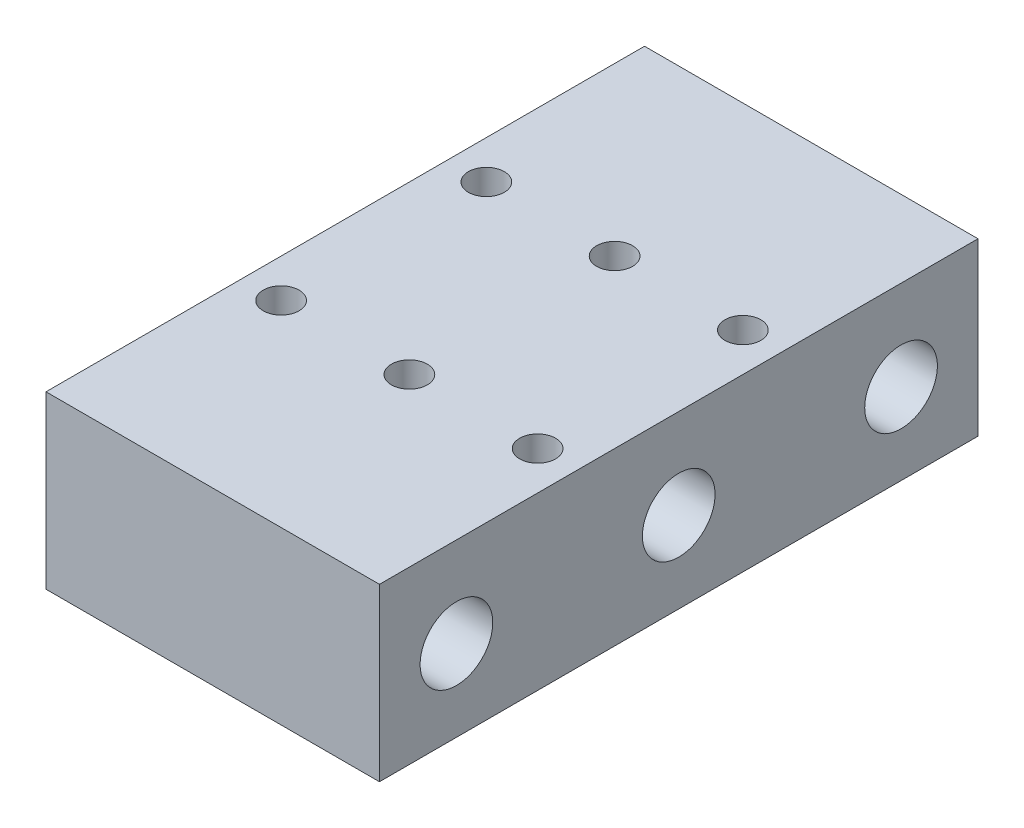
ISO-10303-21;
HEADER;
FILE_DESCRIPTION(('STEP AP214'),'2;1');
FILE_NAME('part.step','',(''),(''),'','','');
FILE_SCHEMA(('AUTOMOTIVE_DESIGN { 1 0 10303 214 1 1 1 1 }'));
ENDSEC;
DATA;
#1=APPLICATION_CONTEXT('core data for automotive mechanical design processes');
#2=APPLICATION_PROTOCOL_DEFINITION('international standard','automotive_design',2000,#1);
#3=PRODUCT_CONTEXT('',#1,'mechanical');
#4=PRODUCT('Part','Part','',(#3));
#5=PRODUCT_RELATED_PRODUCT_CATEGORY('part','',(#4));
#6=PRODUCT_DEFINITION_FORMATION('','',#4);
#7=PRODUCT_DEFINITION_CONTEXT('part definition',#1,'design');
#8=PRODUCT_DEFINITION('design','',#6,#7);
#9=PRODUCT_DEFINITION_SHAPE('','',#8);
#10=(LENGTH_UNIT() NAMED_UNIT(*) SI_UNIT(.MILLI.,.METRE.));
#11=(NAMED_UNIT(*) PLANE_ANGLE_UNIT() SI_UNIT($,.RADIAN.));
#12=(NAMED_UNIT(*) SI_UNIT($,.STERADIAN.) SOLID_ANGLE_UNIT());
#13=UNCERTAINTY_MEASURE_WITH_UNIT(LENGTH_MEASURE(1.E-05),#10,'distance_accuracy_value','');
#14=(GEOMETRIC_REPRESENTATION_CONTEXT(3) GLOBAL_UNCERTAINTY_ASSIGNED_CONTEXT((#13)) GLOBAL_UNIT_ASSIGNED_CONTEXT((#10,
#11,#12)) REPRESENTATION_CONTEXT('',''));
#15=CARTESIAN_POINT('',(0.,0.,0.));
#16=DIRECTION('',(0.,0.,1.));
#17=DIRECTION('',(1.,0.,0.));
#18=AXIS2_PLACEMENT_3D('',#15,#16,#17);
#19=CARTESIAN_POINT('',(19.5,-20.,35.));
#20=DIRECTION('',(1.,0.,0.));
#21=DIRECTION('',(0.,0.,-1.));
#22=AXIS2_PLACEMENT_3D('',#19,#20,#21);
#23=PLANE('',#22);
#24=CARTESIAN_POINT('',(19.5,-10.5,-25.9999999999618));
#25=DIRECTION('',(-1.,0.,0.));
#26=DIRECTION('',(0.,0.,1.));
#27=AXIS2_PLACEMENT_3D('',#24,#25,#26);
#28=CIRCLE('',#27,4.25);
#29=CARTESIAN_POINT('',(19.5,-10.5,-21.7499999999618));
#30=VERTEX_POINT('',#29);
#31=EDGE_CURVE('E204',#30,#30,#28,.T.);
#32=ORIENTED_EDGE('',*,*,#31,.T.);
#33=EDGE_LOOP('',(#32));
#34=FACE_BOUND('',#33,.T.);
#35=CARTESIAN_POINT('',(19.5,-10.5,26.0000000000382));
#36=DIRECTION('',(-1.,0.,0.));
#37=DIRECTION('',(0.,0.,1.));
#38=AXIS2_PLACEMENT_3D('',#35,#36,#37);
#39=CIRCLE('',#38,4.25);
#40=CARTESIAN_POINT('',(19.5,-10.5,30.2500000000382));
#41=VERTEX_POINT('',#40);
#42=EDGE_CURVE('E213',#41,#41,#39,.T.);
#43=ORIENTED_EDGE('',*,*,#42,.T.);
#44=EDGE_LOOP('',(#43));
#45=FACE_BOUND('',#44,.T.);
#46=CARTESIAN_POINT('',(19.5,-10.4999999999909,0.));
#47=DIRECTION('',(-1.,0.,0.));
#48=DIRECTION('',(0.,0.,1.));
#49=AXIS2_PLACEMENT_3D('',#46,#47,#48);
#50=CIRCLE('',#49,4.2499999999998);
#51=CARTESIAN_POINT('',(19.5,-10.4999999999909,4.2499999999998));
#52=VERTEX_POINT('',#51);
#53=EDGE_CURVE('E222',#52,#52,#50,.T.);
#54=ORIENTED_EDGE('',*,*,#53,.T.);
#55=EDGE_LOOP('',(#54));
#56=FACE_BOUND('',#55,.T.);
#57=DIRECTION('',(0.,0.,-1.));
#58=VECTOR('',#57,1.);
#59=CARTESIAN_POINT('',(19.5,0.,35.));
#60=LINE('',#59,#58);
#61=CARTESIAN_POINT('',(19.5,0.,35.));
#62=VERTEX_POINT('',#61);
#63=CARTESIAN_POINT('',(19.5,0.,-35.));
#64=VERTEX_POINT('',#63);
#65=EDGE_CURVE('E107',#62,#64,#60,.T.);
#66=ORIENTED_EDGE('',*,*,#65,.F.);
#67=DIRECTION('',(0.,1.,0.));
#68=VECTOR('',#67,1.);
#69=CARTESIAN_POINT('',(19.5,-20.,35.));
#70=LINE('',#69,#68);
#71=CARTESIAN_POINT('',(19.5,-20.,35.));
#72=VERTEX_POINT('',#71);
#73=EDGE_CURVE('E11',#72,#62,#70,.T.);
#74=ORIENTED_EDGE('',*,*,#73,.F.);
#75=DIRECTION('',(0.,0.,-1.));
#76=VECTOR('',#75,1.);
#77=CARTESIAN_POINT('',(19.5,-20.,35.));
#78=LINE('',#77,#76);
#79=CARTESIAN_POINT('',(19.5,-20.,-35.));
#80=VERTEX_POINT('',#79);
#81=EDGE_CURVE('E101',#72,#80,#78,.T.);
#82=ORIENTED_EDGE('',*,*,#81,.T.);
#83=DIRECTION('',(0.,1.,0.));
#84=VECTOR('',#83,1.);
#85=CARTESIAN_POINT('',(19.5,-20.,-35.));
#86=LINE('',#85,#84);
#87=EDGE_CURVE('E46',#80,#64,#86,.T.);
#88=ORIENTED_EDGE('',*,*,#87,.T.);
#89=EDGE_LOOP('',(#66,#74,#82,#88));
#90=FACE_BOUND('',#89,.T.);
#91=ADVANCED_FACE('F43',(#34,#45,#56,#90),#23,.T.);
#92=CARTESIAN_POINT('',(-19.5,-20.,35.));
#93=DIRECTION('',(0.,0.,1.));
#94=DIRECTION('',(1.,0.,0.));
#95=AXIS2_PLACEMENT_3D('',#92,#93,#94);
#96=PLANE('',#95);
#97=DIRECTION('',(1.,0.,0.));
#98=VECTOR('',#97,1.);
#99=CARTESIAN_POINT('',(-19.5,0.,35.));
#100=LINE('',#99,#98);
#101=CARTESIAN_POINT('',(-19.5,0.,35.));
#102=VERTEX_POINT('',#101);
#103=EDGE_CURVE('E103',#102,#62,#100,.T.);
#104=ORIENTED_EDGE('',*,*,#103,.F.);
#105=DIRECTION('',(0.,1.,0.));
#106=VECTOR('',#105,1.);
#107=CARTESIAN_POINT('',(-19.5,-20.,35.));
#108=LINE('',#107,#106);
#109=CARTESIAN_POINT('',(-19.5,-20.,35.));
#110=VERTEX_POINT('',#109);
#111=EDGE_CURVE('E55',#110,#102,#108,.T.);
#112=ORIENTED_EDGE('',*,*,#111,.F.);
#113=DIRECTION('',(1.,0.,0.));
#114=VECTOR('',#113,1.);
#115=CARTESIAN_POINT('',(-19.5,-20.,35.));
#116=LINE('',#115,#114);
#117=EDGE_CURVE('E98',#110,#72,#116,.T.);
#118=ORIENTED_EDGE('',*,*,#117,.T.);
#119=ORIENTED_EDGE('',*,*,#73,.T.);
#120=EDGE_LOOP('',(#104,#112,#118,#119));
#121=FACE_BOUND('',#120,.T.);
#122=ADVANCED_FACE('F118',(#121),#96,.T.);
#123=CARTESIAN_POINT('',(-19.5,-20.,35.));
#124=DIRECTION('',(-1.,0.,0.));
#125=DIRECTION('',(0.,0.,1.));
#126=AXIS2_PLACEMENT_3D('',#123,#124,#125);
#127=PLANE('',#126);
#128=CARTESIAN_POINT('',(-19.5,-10.5,-25.9999999999618));
#129=DIRECTION('',(-1.,0.,0.));
#130=DIRECTION('',(0.,0.,1.));
#131=AXIS2_PLACEMENT_3D('',#128,#129,#130);
#132=CIRCLE('',#131,4.25);
#133=CARTESIAN_POINT('',(-19.5,-10.5,-21.7499999999618));
#134=VERTEX_POINT('',#133);
#135=EDGE_CURVE('E210',#134,#134,#132,.T.);
#136=ORIENTED_EDGE('',*,*,#135,.F.);
#137=EDGE_LOOP('',(#136));
#138=FACE_BOUND('',#137,.T.);
#139=CARTESIAN_POINT('',(-19.5,-10.5,26.0000000000382));
#140=DIRECTION('',(-1.,0.,0.));
#141=DIRECTION('',(0.,0.,1.));
#142=AXIS2_PLACEMENT_3D('',#139,#140,#141);
#143=CIRCLE('',#142,4.25);
#144=CARTESIAN_POINT('',(-19.5,-10.5,30.2500000000382));
#145=VERTEX_POINT('',#144);
#146=EDGE_CURVE('E208',#145,#145,#143,.T.);
#147=ORIENTED_EDGE('',*,*,#146,.F.);
#148=EDGE_LOOP('',(#147));
#149=FACE_BOUND('',#148,.T.);
#150=CARTESIAN_POINT('',(-19.5,-10.4999999999909,0.));
#151=DIRECTION('',(-1.,0.,0.));
#152=DIRECTION('',(0.,0.,1.));
#153=AXIS2_PLACEMENT_3D('',#150,#151,#152);
#154=CIRCLE('',#153,4.2499999999998);
#155=CARTESIAN_POINT('',(-19.5,-10.4999999999909,4.2499999999998));
#156=VERTEX_POINT('',#155);
#157=EDGE_CURVE('E217',#156,#156,#154,.T.);
#158=ORIENTED_EDGE('',*,*,#157,.F.);
#159=EDGE_LOOP('',(#158));
#160=FACE_BOUND('',#159,.T.);
#161=DIRECTION('',(0.,0.,1.));
#162=VECTOR('',#161,1.);
#163=CARTESIAN_POINT('',(-19.5,0.,35.));
#164=LINE('',#163,#162);
#165=CARTESIAN_POINT('',(-19.5,0.,-35.));
#166=VERTEX_POINT('',#165);
#167=EDGE_CURVE('E91',#166,#102,#164,.T.);
#168=ORIENTED_EDGE('',*,*,#167,.F.);
#169=DIRECTION('',(0.,1.,0.));
#170=VECTOR('',#169,1.);
#171=CARTESIAN_POINT('',(-19.5,-20.,-35.));
#172=LINE('',#171,#170);
#173=CARTESIAN_POINT('',(-19.5,-20.,-35.));
#174=VERTEX_POINT('',#173);
#175=EDGE_CURVE('E86',#174,#166,#172,.T.);
#176=ORIENTED_EDGE('',*,*,#175,.F.);
#177=DIRECTION('',(0.,0.,1.));
#178=VECTOR('',#177,1.);
#179=CARTESIAN_POINT('',(-19.5,-20.,35.));
#180=LINE('',#179,#178);
#181=EDGE_CURVE('E93',#174,#110,#180,.T.);
#182=ORIENTED_EDGE('',*,*,#181,.T.);
#183=ORIENTED_EDGE('',*,*,#111,.T.);
#184=EDGE_LOOP('',(#168,#176,#182,#183));
#185=FACE_BOUND('',#184,.T.);
#186=ADVANCED_FACE('F89',(#138,#149,#160,#185),#127,.T.);
#187=CARTESIAN_POINT('',(-19.5,-20.,-35.));
#188=DIRECTION('',(0.,0.,-1.));
#189=DIRECTION('',(-1.,0.,0.));
#190=AXIS2_PLACEMENT_3D('',#187,#188,#189);
#191=PLANE('',#190);
#192=DIRECTION('',(-1.,0.,0.));
#193=VECTOR('',#192,1.);
#194=CARTESIAN_POINT('',(-19.5,0.,-35.));
#195=LINE('',#194,#193);
#196=EDGE_CURVE('E112',#64,#166,#195,.T.);
#197=ORIENTED_EDGE('',*,*,#196,.F.);
#198=ORIENTED_EDGE('',*,*,#87,.F.);
#199=DIRECTION('',(-1.,0.,0.));
#200=VECTOR('',#199,1.);
#201=CARTESIAN_POINT('',(-19.5,-20.,-35.));
#202=LINE('',#201,#200);
#203=EDGE_CURVE('E100',#80,#174,#202,.T.);
#204=ORIENTED_EDGE('',*,*,#203,.T.);
#205=ORIENTED_EDGE('',*,*,#175,.T.);
#206=EDGE_LOOP('',(#197,#198,#204,#205));
#207=FACE_BOUND('',#206,.T.);
#208=ADVANCED_FACE('F99',(#207),#191,.T.);
#209=CARTESIAN_POINT('',(0.,-20.,0.));
#210=DIRECTION('',(0.,-1.,0.));
#211=DIRECTION('',(0.,0.,-1.));
#212=AXIS2_PLACEMENT_3D('',#209,#210,#211);
#213=PLANE('',#212);
#214=ORIENTED_EDGE('',*,*,#81,.F.);
#215=ORIENTED_EDGE('',*,*,#117,.F.);
#216=ORIENTED_EDGE('',*,*,#181,.F.);
#217=ORIENTED_EDGE('',*,*,#203,.F.);
#218=EDGE_LOOP('',(#214,#215,#216,#217));
#219=FACE_BOUND('',#218,.T.);
#220=ADVANCED_FACE('F96',(#219),#213,.T.);
#221=CARTESIAN_POINT('',(0.,0.,0.));
#222=DIRECTION('',(0.,-1.,0.));
#223=DIRECTION('',(0.,0.,-1.));
#224=AXIS2_PLACEMENT_3D('',#221,#222,#223);
#225=PLANE('',#224);
#226=CARTESIAN_POINT('',(15.,0.,-12.));
#227=DIRECTION('',(0.,1.,0.));
#228=DIRECTION('',(0.,0.,1.));
#229=AXIS2_PLACEMENT_3D('',#226,#227,#228);
#230=CIRCLE('',#229,2.1);
#231=CARTESIAN_POINT('',(15.,0.,-9.9));
#232=VERTEX_POINT('',#231);
#233=EDGE_CURVE('E229',#232,#232,#230,.T.);
#234=ORIENTED_EDGE('',*,*,#233,.F.);
#235=EDGE_LOOP('',(#234));
#236=FACE_BOUND('',#235,.T.);
#237=CARTESIAN_POINT('',(0.,0.,-12.));
#238=DIRECTION('',(0.,1.,0.));
#239=DIRECTION('',(0.,0.,1.));
#240=AXIS2_PLACEMENT_3D('',#237,#238,#239);
#241=CIRCLE('',#240,2.1);
#242=CARTESIAN_POINT('',(0.,0.,-9.9));
#243=VERTEX_POINT('',#242);
#244=EDGE_CURVE('E240',#243,#243,#241,.T.);
#245=ORIENTED_EDGE('',*,*,#244,.F.);
#246=EDGE_LOOP('',(#245));
#247=FACE_BOUND('',#246,.T.);
#248=CARTESIAN_POINT('',(-15.,0.,12.));
#249=DIRECTION('',(0.,1.,0.));
#250=DIRECTION('',(0.,0.,1.));
#251=AXIS2_PLACEMENT_3D('',#248,#249,#250);
#252=CIRCLE('',#251,2.1);
#253=CARTESIAN_POINT('',(-15.,0.,14.1));
#254=VERTEX_POINT('',#253);
#255=EDGE_CURVE('E242',#254,#254,#252,.T.);
#256=ORIENTED_EDGE('',*,*,#255,.F.);
#257=EDGE_LOOP('',(#256));
#258=FACE_BOUND('',#257,.T.);
#259=CARTESIAN_POINT('',(0.,0.,12.));
#260=DIRECTION('',(0.,1.,0.));
#261=DIRECTION('',(0.,0.,1.));
#262=AXIS2_PLACEMENT_3D('',#259,#260,#261);
#263=CIRCLE('',#262,2.1);
#264=CARTESIAN_POINT('',(0.,0.,14.1));
#265=VERTEX_POINT('',#264);
#266=EDGE_CURVE('E248',#265,#265,#263,.T.);
#267=ORIENTED_EDGE('',*,*,#266,.F.);
#268=EDGE_LOOP('',(#267));
#269=FACE_BOUND('',#268,.T.);
#270=CARTESIAN_POINT('',(15.,0.,12.));
#271=DIRECTION('',(0.,1.,0.));
#272=DIRECTION('',(0.,0.,1.));
#273=AXIS2_PLACEMENT_3D('',#270,#271,#272);
#274=CIRCLE('',#273,2.1);
#275=CARTESIAN_POINT('',(15.,0.,14.1));
#276=VERTEX_POINT('',#275);
#277=EDGE_CURVE('E221',#276,#276,#274,.T.);
#278=ORIENTED_EDGE('',*,*,#277,.F.);
#279=EDGE_LOOP('',(#278));
#280=FACE_BOUND('',#279,.T.);
#281=CARTESIAN_POINT('',(-15.,0.,-12.));
#282=DIRECTION('',(0.,1.,0.));
#283=DIRECTION('',(0.,0.,1.));
#284=AXIS2_PLACEMENT_3D('',#281,#282,#283);
#285=CIRCLE('',#284,2.1);
#286=CARTESIAN_POINT('',(-15.,0.,-9.9));
#287=VERTEX_POINT('',#286);
#288=EDGE_CURVE('E232',#287,#287,#285,.T.);
#289=ORIENTED_EDGE('',*,*,#288,.F.);
#290=EDGE_LOOP('',(#289));
#291=FACE_BOUND('',#290,.T.);
#292=ORIENTED_EDGE('',*,*,#65,.T.);
#293=ORIENTED_EDGE('',*,*,#196,.T.);
#294=ORIENTED_EDGE('',*,*,#167,.T.);
#295=ORIENTED_EDGE('',*,*,#103,.T.);
#296=EDGE_LOOP('',(#292,#293,#294,#295));
#297=FACE_BOUND('',#296,.T.);
#298=ADVANCED_FACE('F117',(#236,#247,#258,#269,#280,#291,#297),#225,.F.);
#299=CARTESIAN_POINT('',(-15.,-15.,-12.));
#300=DIRECTION('',(0.,1.,0.));
#301=DIRECTION('',(0.,0.,1.));
#302=AXIS2_PLACEMENT_3D('',#299,#300,#301);
#303=CYLINDRICAL_SURFACE('',#302,2.1);
#304=CARTESIAN_POINT('',(-15.,-15.,-12.));
#305=DIRECTION('',(0.,1.,0.));
#306=DIRECTION('',(0.,0.,1.));
#307=AXIS2_PLACEMENT_3D('',#304,#305,#306);
#308=CIRCLE('',#307,2.1);
#309=CARTESIAN_POINT('',(-15.,-15.,-9.9));
#310=VERTEX_POINT('',#309);
#311=EDGE_CURVE('E115',#310,#310,#308,.T.);
#312=ORIENTED_EDGE('',*,*,#311,.F.);
#313=EDGE_LOOP('',(#312));
#314=FACE_BOUND('',#313,.T.);
#315=ORIENTED_EDGE('',*,*,#288,.T.);
#316=EDGE_LOOP('',(#315));
#317=FACE_BOUND('',#316,.T.);
#318=ADVANCED_FACE('F140',(#314,#317),#303,.F.);
#319=CARTESIAN_POINT('',(-15.,-15.,-12.));
#320=DIRECTION('',(0.,1.,0.));
#321=DIRECTION('',(0.,0.,1.));
#322=AXIS2_PLACEMENT_3D('',#319,#320,#321);
#323=PLANE('',#322);
#324=ORIENTED_EDGE('',*,*,#311,.T.);
#325=EDGE_LOOP('',(#324));
#326=FACE_BOUND('',#325,.T.);
#327=ADVANCED_FACE('F141',(#326),#323,.T.);
#328=CARTESIAN_POINT('',(15.,-15.,12.));
#329=DIRECTION('',(0.,1.,0.));
#330=DIRECTION('',(0.,0.,1.));
#331=AXIS2_PLACEMENT_3D('',#328,#329,#330);
#332=CYLINDRICAL_SURFACE('',#331,2.1);
#333=CARTESIAN_POINT('',(15.,-15.,12.));
#334=DIRECTION('',(0.,1.,0.));
#335=DIRECTION('',(0.,0.,1.));
#336=AXIS2_PLACEMENT_3D('',#333,#334,#335);
#337=CIRCLE('',#336,2.1);
#338=CARTESIAN_POINT('',(15.,-15.,14.1));
#339=VERTEX_POINT('',#338);
#340=EDGE_CURVE('E209',#339,#339,#337,.T.);
#341=ORIENTED_EDGE('',*,*,#340,.F.);
#342=EDGE_LOOP('',(#341));
#343=FACE_BOUND('',#342,.T.);
#344=ORIENTED_EDGE('',*,*,#277,.T.);
#345=EDGE_LOOP('',(#344));
#346=FACE_BOUND('',#345,.T.);
#347=ADVANCED_FACE('F150',(#343,#346),#332,.F.);
#348=CARTESIAN_POINT('',(15.,-15.,12.));
#349=DIRECTION('',(0.,1.,0.));
#350=DIRECTION('',(0.,0.,1.));
#351=AXIS2_PLACEMENT_3D('',#348,#349,#350);
#352=PLANE('',#351);
#353=ORIENTED_EDGE('',*,*,#340,.T.);
#354=EDGE_LOOP('',(#353));
#355=FACE_BOUND('',#354,.T.);
#356=ADVANCED_FACE('F160',(#355),#352,.T.);
#357=CARTESIAN_POINT('',(0.,-15.,12.));
#358=DIRECTION('',(0.,1.,0.));
#359=DIRECTION('',(0.,0.,1.));
#360=AXIS2_PLACEMENT_3D('',#357,#358,#359);
#361=CYLINDRICAL_SURFACE('',#360,2.1);
#362=CARTESIAN_POINT('',(0.,-15.,12.));
#363=DIRECTION('',(0.,1.,0.));
#364=DIRECTION('',(0.,0.,1.));
#365=AXIS2_PLACEMENT_3D('',#362,#363,#364);
#366=CIRCLE('',#365,2.1);
#367=CARTESIAN_POINT('',(0.,-15.,14.1));
#368=VERTEX_POINT('',#367);
#369=EDGE_CURVE('E230',#368,#368,#366,.T.);
#370=ORIENTED_EDGE('',*,*,#369,.F.);
#371=EDGE_LOOP('',(#370));
#372=FACE_BOUND('',#371,.T.);
#373=ORIENTED_EDGE('',*,*,#266,.T.);
#374=EDGE_LOOP('',(#373));
#375=FACE_BOUND('',#374,.T.);
#376=ADVANCED_FACE('F153',(#372,#375),#361,.F.);
#377=CARTESIAN_POINT('',(0.,-15.,12.));
#378=DIRECTION('',(0.,1.,0.));
#379=DIRECTION('',(0.,0.,1.));
#380=AXIS2_PLACEMENT_3D('',#377,#378,#379);
#381=PLANE('',#380);
#382=ORIENTED_EDGE('',*,*,#369,.T.);
#383=EDGE_LOOP('',(#382));
#384=FACE_BOUND('',#383,.T.);
#385=ADVANCED_FACE('F149',(#384),#381,.T.);
#386=CARTESIAN_POINT('',(-15.,-15.,12.));
#387=DIRECTION('',(0.,1.,0.));
#388=DIRECTION('',(0.,0.,1.));
#389=AXIS2_PLACEMENT_3D('',#386,#387,#388);
#390=CYLINDRICAL_SURFACE('',#389,2.1);
#391=CARTESIAN_POINT('',(-15.,-15.,12.));
#392=DIRECTION('',(0.,1.,0.));
#393=DIRECTION('',(0.,0.,1.));
#394=AXIS2_PLACEMENT_3D('',#391,#392,#393);
#395=CIRCLE('',#394,2.1);
#396=CARTESIAN_POINT('',(-15.,-15.,14.1));
#397=VERTEX_POINT('',#396);
#398=EDGE_CURVE('E249',#397,#397,#395,.T.);
#399=ORIENTED_EDGE('',*,*,#398,.F.);
#400=EDGE_LOOP('',(#399));
#401=FACE_BOUND('',#400,.T.);
#402=ORIENTED_EDGE('',*,*,#255,.T.);
#403=EDGE_LOOP('',(#402));
#404=FACE_BOUND('',#403,.T.);
#405=ADVANCED_FACE('F155',(#401,#404),#390,.F.);
#406=CARTESIAN_POINT('',(-15.,-15.,12.));
#407=DIRECTION('',(0.,1.,0.));
#408=DIRECTION('',(0.,0.,1.));
#409=AXIS2_PLACEMENT_3D('',#406,#407,#408);
#410=PLANE('',#409);
#411=ORIENTED_EDGE('',*,*,#398,.T.);
#412=EDGE_LOOP('',(#411));
#413=FACE_BOUND('',#412,.T.);
#414=ADVANCED_FACE('F157',(#413),#410,.T.);
#415=CARTESIAN_POINT('',(0.,-15.,-12.));
#416=DIRECTION('',(0.,1.,0.));
#417=DIRECTION('',(0.,0.,1.));
#418=AXIS2_PLACEMENT_3D('',#415,#416,#417);
#419=CYLINDRICAL_SURFACE('',#418,2.1);
#420=CARTESIAN_POINT('',(0.,-15.,-12.));
#421=DIRECTION('',(0.,1.,0.));
#422=DIRECTION('',(0.,0.,1.));
#423=AXIS2_PLACEMENT_3D('',#420,#421,#422);
#424=CIRCLE('',#423,2.1);
#425=CARTESIAN_POINT('',(0.,-15.,-9.9));
#426=VERTEX_POINT('',#425);
#427=EDGE_CURVE('E238',#426,#426,#424,.T.);
#428=ORIENTED_EDGE('',*,*,#427,.F.);
#429=EDGE_LOOP('',(#428));
#430=FACE_BOUND('',#429,.T.);
#431=ORIENTED_EDGE('',*,*,#244,.T.);
#432=EDGE_LOOP('',(#431));
#433=FACE_BOUND('',#432,.T.);
#434=ADVANCED_FACE('F165',(#430,#433),#419,.F.);
#435=CARTESIAN_POINT('',(0.,-15.,-12.));
#436=DIRECTION('',(0.,1.,0.));
#437=DIRECTION('',(0.,0.,1.));
#438=AXIS2_PLACEMENT_3D('',#435,#436,#437);
#439=PLANE('',#438);
#440=ORIENTED_EDGE('',*,*,#427,.T.);
#441=EDGE_LOOP('',(#440));
#442=FACE_BOUND('',#441,.T.);
#443=ADVANCED_FACE('F170',(#442),#439,.T.);
#444=CARTESIAN_POINT('',(15.,-15.,-12.));
#445=DIRECTION('',(0.,1.,0.));
#446=DIRECTION('',(0.,0.,1.));
#447=AXIS2_PLACEMENT_3D('',#444,#445,#446);
#448=CYLINDRICAL_SURFACE('',#447,2.1);
#449=CARTESIAN_POINT('',(15.,-15.,-12.));
#450=DIRECTION('',(0.,1.,0.));
#451=DIRECTION('',(0.,0.,1.));
#452=AXIS2_PLACEMENT_3D('',#449,#450,#451);
#453=CIRCLE('',#452,2.1);
#454=CARTESIAN_POINT('',(15.,-15.,-9.9));
#455=VERTEX_POINT('',#454);
#456=EDGE_CURVE('E235',#455,#455,#453,.T.);
#457=ORIENTED_EDGE('',*,*,#456,.F.);
#458=EDGE_LOOP('',(#457));
#459=FACE_BOUND('',#458,.T.);
#460=ORIENTED_EDGE('',*,*,#233,.T.);
#461=EDGE_LOOP('',(#460));
#462=FACE_BOUND('',#461,.T.);
#463=ADVANCED_FACE('F168',(#459,#462),#448,.F.);
#464=CARTESIAN_POINT('',(15.,-15.,-12.));
#465=DIRECTION('',(0.,1.,0.));
#466=DIRECTION('',(0.,0.,1.));
#467=AXIS2_PLACEMENT_3D('',#464,#465,#466);
#468=PLANE('',#467);
#469=ORIENTED_EDGE('',*,*,#456,.T.);
#470=EDGE_LOOP('',(#469));
#471=FACE_BOUND('',#470,.T.);
#472=ADVANCED_FACE('F174',(#471),#468,.T.);
#473=CARTESIAN_POINT('',(19.5,-10.4999999999909,0.));
#474=DIRECTION('',(-1.,0.,0.));
#475=DIRECTION('',(0.,0.,1.));
#476=AXIS2_PLACEMENT_3D('',#473,#474,#475);
#477=CYLINDRICAL_SURFACE('',#476,4.2499999999998);
#478=ORIENTED_EDGE('',*,*,#53,.F.);
#479=EDGE_LOOP('',(#478));
#480=FACE_BOUND('',#479,.T.);
#481=ORIENTED_EDGE('',*,*,#157,.T.);
#482=EDGE_LOOP('',(#481));
#483=FACE_BOUND('',#482,.T.);
#484=ADVANCED_FACE('F177',(#480,#483),#477,.F.);
#485=CARTESIAN_POINT('',(19.5,-10.5,26.0000000000382));
#486=DIRECTION('',(-1.,0.,0.));
#487=DIRECTION('',(0.,0.,1.));
#488=AXIS2_PLACEMENT_3D('',#485,#486,#487);
#489=CYLINDRICAL_SURFACE('',#488,4.25);
#490=ORIENTED_EDGE('',*,*,#42,.F.);
#491=EDGE_LOOP('',(#490));
#492=FACE_BOUND('',#491,.T.);
#493=ORIENTED_EDGE('',*,*,#146,.T.);
#494=EDGE_LOOP('',(#493));
#495=FACE_BOUND('',#494,.T.);
#496=ADVANCED_FACE('F194',(#492,#495),#489,.F.);
#497=CARTESIAN_POINT('',(19.5,-10.5,-25.9999999999618));
#498=DIRECTION('',(-1.,0.,0.));
#499=DIRECTION('',(0.,0.,1.));
#500=AXIS2_PLACEMENT_3D('',#497,#498,#499);
#501=CYLINDRICAL_SURFACE('',#500,4.25);
#502=ORIENTED_EDGE('',*,*,#31,.F.);
#503=EDGE_LOOP('',(#502));
#504=FACE_BOUND('',#503,.T.);
#505=ORIENTED_EDGE('',*,*,#135,.T.);
#506=EDGE_LOOP('',(#505));
#507=FACE_BOUND('',#506,.T.);
#508=ADVANCED_FACE('F192',(#504,#507),#501,.F.);
#509=CLOSED_SHELL('',(#91,#122,#186,#208,#220,#298,#318,#327,#347,#356,#376,#385,#405,#414,#434,
#443,#463,#472,#484,#496,#508));
#510=MANIFOLD_SOLID_BREP('B2',#509);
#511=ADVANCED_BREP_SHAPE_REPRESENTATION('',(#18,#510),#14);
#512=SHAPE_DEFINITION_REPRESENTATION(#9,#511);
ENDSEC;
END-ISO-10303-21;
